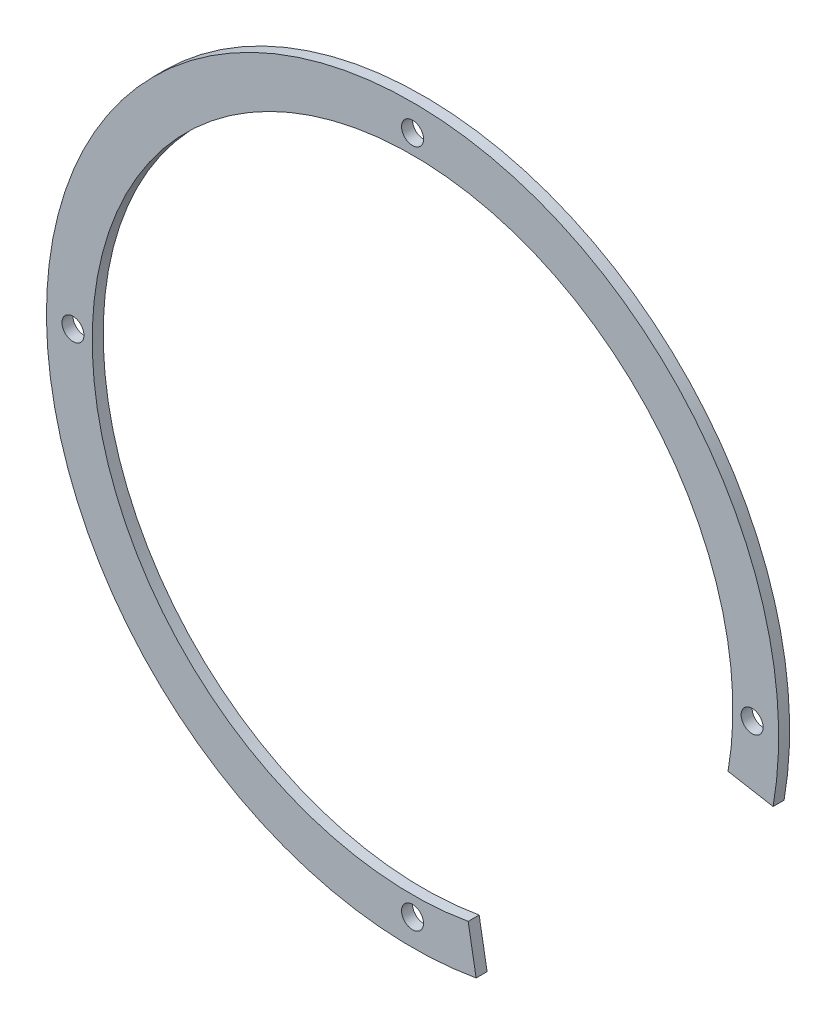
ISO-10303-21;
HEADER;
FILE_DESCRIPTION(('STEP AP214'),'2;1');
FILE_NAME('part.step','',(''),(''),'','','');
FILE_SCHEMA(('AUTOMOTIVE_DESIGN { 1 0 10303 214 1 1 1 1 }'));
ENDSEC;
DATA;
#1=APPLICATION_CONTEXT('core data for automotive mechanical design processes');
#2=APPLICATION_PROTOCOL_DEFINITION('international standard','automotive_design',2000,#1);
#3=PRODUCT_CONTEXT('',#1,'mechanical');
#4=PRODUCT('Part','Part','',(#3));
#5=PRODUCT_RELATED_PRODUCT_CATEGORY('part','',(#4));
#6=PRODUCT_DEFINITION_FORMATION('','',#4);
#7=PRODUCT_DEFINITION_CONTEXT('part definition',#1,'design');
#8=PRODUCT_DEFINITION('design','',#6,#7);
#9=PRODUCT_DEFINITION_SHAPE('','',#8);
#10=(LENGTH_UNIT() NAMED_UNIT(*) SI_UNIT(.MILLI.,.METRE.));
#11=(NAMED_UNIT(*) PLANE_ANGLE_UNIT() SI_UNIT($,.RADIAN.));
#12=(NAMED_UNIT(*) SI_UNIT($,.STERADIAN.) SOLID_ANGLE_UNIT());
#13=UNCERTAINTY_MEASURE_WITH_UNIT(LENGTH_MEASURE(1.E-05),#10,'distance_accuracy_value','');
#14=(GEOMETRIC_REPRESENTATION_CONTEXT(3) GLOBAL_UNCERTAINTY_ASSIGNED_CONTEXT((#13)) GLOBAL_UNIT_ASSIGNED_CONTEXT((#10,
#11,#12)) REPRESENTATION_CONTEXT('',''));
#15=CARTESIAN_POINT('',(0.,0.,0.));
#16=DIRECTION('',(0.,0.,1.));
#17=DIRECTION('',(1.,0.,0.));
#18=AXIS2_PLACEMENT_3D('',#15,#16,#17);
#19=CARTESIAN_POINT('',(0.,0.,3.));
#20=DIRECTION('',(0.,0.,1.));
#21=DIRECTION('',(1.,0.,0.));
#22=AXIS2_PLACEMENT_3D('',#19,#20,#21);
#23=PLANE('',#22);
#24=CARTESIAN_POINT('',(5.2949446201611E-12,-92.75,3.));
#25=DIRECTION('',(0.,0.,1.));
#26=DIRECTION('',(1.,0.,0.));
#27=AXIS2_PLACEMENT_3D('',#24,#25,#26);
#28=CIRCLE('',#27,3.);
#29=CARTESIAN_POINT('',(3.0000000000053,-92.75,3.));
#30=VERTEX_POINT('',#29);
#31=EDGE_CURVE('E109',#30,#30,#28,.T.);
#32=ORIENTED_EDGE('',*,*,#31,.F.);
#33=EDGE_LOOP('',(#32));
#34=FACE_BOUND('',#33,.T.);
#35=CARTESIAN_POINT('',(0.,92.75,3.));
#36=DIRECTION('',(0.,0.,1.));
#37=DIRECTION('',(1.,0.,0.));
#38=AXIS2_PLACEMENT_3D('',#35,#36,#37);
#39=CIRCLE('',#38,3.);
#40=CARTESIAN_POINT('',(3.,92.75,3.));
#41=VERTEX_POINT('',#40);
#42=EDGE_CURVE('E96',#41,#41,#39,.T.);
#43=ORIENTED_EDGE('',*,*,#42,.F.);
#44=EDGE_LOOP('',(#43));
#45=FACE_BOUND('',#44,.T.);
#46=CARTESIAN_POINT('',(92.7500000000026,2.64741107774059E-12,3.));
#47=DIRECTION('',(0.,0.,1.));
#48=DIRECTION('',(1.,0.,0.));
#49=AXIS2_PLACEMENT_3D('',#46,#47,#48);
#50=CIRCLE('',#49,3.00000000000001);
#51=CARTESIAN_POINT('',(95.7500000000027,2.64741107774059E-12,3.));
#52=VERTEX_POINT('',#51);
#53=EDGE_CURVE('E104',#52,#52,#50,.T.);
#54=ORIENTED_EDGE('',*,*,#53,.F.);
#55=EDGE_LOOP('',(#54));
#56=FACE_BOUND('',#55,.T.);
#57=CARTESIAN_POINT('',(-92.7499999999974,-2.65876967680269E-12,3.));
#58=DIRECTION('',(0.,0.,1.));
#59=DIRECTION('',(1.,0.,0.));
#60=AXIS2_PLACEMENT_3D('',#57,#58,#59);
#61=CIRCLE('',#60,3.00000000000001);
#62=CARTESIAN_POINT('',(-89.7499999999974,-2.65876967680269E-12,3.));
#63=VERTEX_POINT('',#62);
#64=EDGE_CURVE('E115',#63,#63,#61,.T.);
#65=ORIENTED_EDGE('',*,*,#64,.F.);
#66=EDGE_LOOP('',(#65));
#67=FACE_BOUND('',#66,.T.);
#68=CARTESIAN_POINT('',(0.,0.,3.));
#69=DIRECTION('',(0.,0.,1.));
#70=DIRECTION('',(1.,0.,0.));
#71=AXIS2_PLACEMENT_3D('',#68,#69,#70);
#72=CIRCLE('',#71,87.5);
#73=CARTESIAN_POINT('',(86.1706783885682,-15.1942155458564,3.));
#74=VERTEX_POINT('',#73);
#75=CARTESIAN_POINT('',(15.1942155458561,-86.1706783885683,3.));
#76=VERTEX_POINT('',#75);
#77=EDGE_CURVE('E95',#74,#76,#72,.T.);
#78=ORIENTED_EDGE('',*,*,#77,.F.);
#79=DIRECTION('',(0.984807753012208,-0.173648177666931,0.));
#80=VECTOR('',#79,1.);
#81=CARTESIAN_POINT('',(0.,0.,3.));
#82=LINE('',#81,#80);
#83=CARTESIAN_POINT('',(98.4807753012208,-17.3648177666931,3.));
#84=VERTEX_POINT('',#83);
#85=EDGE_CURVE('E60',#74,#84,#82,.T.);
#86=ORIENTED_EDGE('',*,*,#85,.T.);
#87=CARTESIAN_POINT('',(0.,0.,3.));
#88=DIRECTION('',(0.,0.,1.));
#89=DIRECTION('',(1.,0.,0.));
#90=AXIS2_PLACEMENT_3D('',#87,#88,#89);
#91=CIRCLE('',#90,100.);
#92=CARTESIAN_POINT('',(17.3648177666927,-98.4807753012209,3.));
#93=VERTEX_POINT('',#92);
#94=EDGE_CURVE('E11',#84,#93,#91,.T.);
#95=ORIENTED_EDGE('',*,*,#94,.T.);
#96=DIRECTION('',(0.173648177666927,-0.984807753012209,0.));
#97=VECTOR('',#96,1.);
#98=CARTESIAN_POINT('',(0.,0.,3.));
#99=LINE('',#98,#97);
#100=EDGE_CURVE('E92',#76,#93,#99,.T.);
#101=ORIENTED_EDGE('',*,*,#100,.F.);
#102=EDGE_LOOP('',(#78,#86,#95,#101));
#103=FACE_BOUND('',#102,.T.);
#104=ADVANCED_FACE('F37',(#34,#45,#56,#67,#103),#23,.T.);
#105=CARTESIAN_POINT('',(0.,0.,0.));
#106=DIRECTION('',(0.,0.,1.));
#107=DIRECTION('',(1.,0.,0.));
#108=AXIS2_PLACEMENT_3D('',#105,#106,#107);
#109=PLANE('',#108);
#110=CARTESIAN_POINT('',(-92.7499999999974,-2.65876967680269E-12,0.));
#111=DIRECTION('',(0.,0.,1.));
#112=DIRECTION('',(1.,0.,0.));
#113=AXIS2_PLACEMENT_3D('',#110,#111,#112);
#114=CIRCLE('',#113,3.00000000000001);
#115=CARTESIAN_POINT('',(-89.7499999999974,-2.65876967680269E-12,0.));
#116=VERTEX_POINT('',#115);
#117=EDGE_CURVE('E118',#116,#116,#114,.T.);
#118=ORIENTED_EDGE('',*,*,#117,.T.);
#119=EDGE_LOOP('',(#118));
#120=FACE_BOUND('',#119,.T.);
#121=CARTESIAN_POINT('',(5.2949446201611E-12,-92.75,0.));
#122=DIRECTION('',(0.,0.,1.));
#123=DIRECTION('',(1.,0.,0.));
#124=AXIS2_PLACEMENT_3D('',#121,#122,#123);
#125=CIRCLE('',#124,3.);
#126=CARTESIAN_POINT('',(3.0000000000053,-92.75,0.));
#127=VERTEX_POINT('',#126);
#128=EDGE_CURVE('E112',#127,#127,#125,.T.);
#129=ORIENTED_EDGE('',*,*,#128,.T.);
#130=EDGE_LOOP('',(#129));
#131=FACE_BOUND('',#130,.T.);
#132=CARTESIAN_POINT('',(92.7500000000026,2.64741107774059E-12,0.));
#133=DIRECTION('',(0.,0.,1.));
#134=DIRECTION('',(1.,0.,0.));
#135=AXIS2_PLACEMENT_3D('',#132,#133,#134);
#136=CIRCLE('',#135,3.00000000000001);
#137=CARTESIAN_POINT('',(95.7500000000027,2.64741107774059E-12,0.));
#138=VERTEX_POINT('',#137);
#139=EDGE_CURVE('E106',#138,#138,#136,.T.);
#140=ORIENTED_EDGE('',*,*,#139,.T.);
#141=EDGE_LOOP('',(#140));
#142=FACE_BOUND('',#141,.T.);
#143=CARTESIAN_POINT('',(0.,92.75,0.));
#144=DIRECTION('',(0.,0.,1.));
#145=DIRECTION('',(1.,0.,0.));
#146=AXIS2_PLACEMENT_3D('',#143,#144,#145);
#147=CIRCLE('',#146,3.);
#148=CARTESIAN_POINT('',(3.,92.75,0.));
#149=VERTEX_POINT('',#148);
#150=EDGE_CURVE('E100',#149,#149,#147,.T.);
#151=ORIENTED_EDGE('',*,*,#150,.T.);
#152=EDGE_LOOP('',(#151));
#153=FACE_BOUND('',#152,.T.);
#154=DIRECTION('',(0.984807753012208,-0.173648177666931,0.));
#155=VECTOR('',#154,1.);
#156=CARTESIAN_POINT('',(0.,0.,0.));
#157=LINE('',#156,#155);
#158=CARTESIAN_POINT('',(86.1706783885682,-15.1942155458564,0.));
#159=VERTEX_POINT('',#158);
#160=CARTESIAN_POINT('',(98.4807753012208,-17.3648177666931,0.));
#161=VERTEX_POINT('',#160);
#162=EDGE_CURVE('E78',#159,#161,#157,.T.);
#163=ORIENTED_EDGE('',*,*,#162,.F.);
#164=CARTESIAN_POINT('',(0.,0.,0.));
#165=DIRECTION('',(0.,0.,1.));
#166=DIRECTION('',(1.,0.,0.));
#167=AXIS2_PLACEMENT_3D('',#164,#165,#166);
#168=CIRCLE('',#167,87.5);
#169=CARTESIAN_POINT('',(15.1942155458561,-86.1706783885682,0.));
#170=VERTEX_POINT('',#169);
#171=EDGE_CURVE('E90',#159,#170,#168,.T.);
#172=ORIENTED_EDGE('',*,*,#171,.T.);
#173=DIRECTION('',(0.173648177666927,-0.984807753012209,0.));
#174=VECTOR('',#173,1.);
#175=CARTESIAN_POINT('',(0.,0.,0.));
#176=LINE('',#175,#174);
#177=CARTESIAN_POINT('',(17.3648177666927,-98.4807753012209,0.));
#178=VERTEX_POINT('',#177);
#179=EDGE_CURVE('E52',#170,#178,#176,.T.);
#180=ORIENTED_EDGE('',*,*,#179,.T.);
#181=CARTESIAN_POINT('',(0.,0.,0.));
#182=DIRECTION('',(0.,0.,1.));
#183=DIRECTION('',(1.,0.,0.));
#184=AXIS2_PLACEMENT_3D('',#181,#182,#183);
#185=CIRCLE('',#184,100.);
#186=EDGE_CURVE('E41',#161,#178,#185,.T.);
#187=ORIENTED_EDGE('',*,*,#186,.F.);
#188=EDGE_LOOP('',(#163,#172,#180,#187));
#189=FACE_BOUND('',#188,.T.);
#190=ADVANCED_FACE('F89',(#120,#131,#142,#153,#189),#109,.F.);
#191=CARTESIAN_POINT('',(0.,0.,3.));
#192=DIRECTION('',(0.,0.,-1.));
#193=DIRECTION('',(-1.,0.,0.));
#194=AXIS2_PLACEMENT_3D('',#191,#192,#193);
#195=CYLINDRICAL_SURFACE('',#194,100.);
#196=DIRECTION('',(0.,0.,1.));
#197=VECTOR('',#196,1.);
#198=CARTESIAN_POINT('',(98.4807753012208,-17.3648177666931,0.));
#199=LINE('',#198,#197);
#200=EDGE_CURVE('E121',#161,#84,#199,.T.);
#201=ORIENTED_EDGE('',*,*,#200,.F.);
#202=ORIENTED_EDGE('',*,*,#186,.T.);
#203=DIRECTION('',(0.,0.,1.));
#204=VECTOR('',#203,1.);
#205=CARTESIAN_POINT('',(17.3648177666927,-98.4807753012209,0.));
#206=LINE('',#205,#204);
#207=EDGE_CURVE('E125',#178,#93,#206,.T.);
#208=ORIENTED_EDGE('',*,*,#207,.T.);
#209=ORIENTED_EDGE('',*,*,#94,.F.);
#210=EDGE_LOOP('',(#201,#202,#208,#209));
#211=FACE_BOUND('',#210,.T.);
#212=ADVANCED_FACE('F39',(#211),#195,.T.);
#213=CARTESIAN_POINT('',(0.,0.,3.));
#214=DIRECTION('',(0.,0.,-1.));
#215=DIRECTION('',(-1.,0.,0.));
#216=AXIS2_PLACEMENT_3D('',#213,#214,#215);
#217=CYLINDRICAL_SURFACE('',#216,87.5);
#218=ORIENTED_EDGE('',*,*,#171,.F.);
#219=DIRECTION('',(0.,0.,1.));
#220=VECTOR('',#219,1.);
#221=CARTESIAN_POINT('',(86.1706783885682,-15.1942155458564,0.));
#222=LINE('',#221,#220);
#223=EDGE_CURVE('E75',#159,#74,#222,.T.);
#224=ORIENTED_EDGE('',*,*,#223,.T.);
#225=ORIENTED_EDGE('',*,*,#77,.T.);
#226=DIRECTION('',(0.,0.,1.));
#227=VECTOR('',#226,1.);
#228=CARTESIAN_POINT('',(15.1942155458561,-86.1706783885683,0.));
#229=LINE('',#228,#227);
#230=EDGE_CURVE('E84',#170,#76,#229,.T.);
#231=ORIENTED_EDGE('',*,*,#230,.F.);
#232=EDGE_LOOP('',(#218,#224,#225,#231));
#233=FACE_BOUND('',#232,.T.);
#234=ADVANCED_FACE('F94',(#233),#217,.F.);
#235=CARTESIAN_POINT('',(0.,92.75,3.));
#236=DIRECTION('',(0.,0.,-1.));
#237=DIRECTION('',(-1.,0.,0.));
#238=AXIS2_PLACEMENT_3D('',#235,#236,#237);
#239=CYLINDRICAL_SURFACE('',#238,3.);
#240=ORIENTED_EDGE('',*,*,#42,.T.);
#241=EDGE_LOOP('',(#240));
#242=FACE_BOUND('',#241,.T.);
#243=ORIENTED_EDGE('',*,*,#150,.F.);
#244=EDGE_LOOP('',(#243));
#245=FACE_BOUND('',#244,.T.);
#246=ADVANCED_FACE('F161',(#242,#245),#239,.F.);
#247=CARTESIAN_POINT('',(92.7500000000026,2.64741107774059E-12,3.));
#248=DIRECTION('',(0.,0.,-1.));
#249=DIRECTION('',(-1.,0.,0.));
#250=AXIS2_PLACEMENT_3D('',#247,#248,#249);
#251=CYLINDRICAL_SURFACE('',#250,3.00000000000001);
#252=ORIENTED_EDGE('',*,*,#53,.T.);
#253=EDGE_LOOP('',(#252));
#254=FACE_BOUND('',#253,.T.);
#255=ORIENTED_EDGE('',*,*,#139,.F.);
#256=EDGE_LOOP('',(#255));
#257=FACE_BOUND('',#256,.T.);
#258=ADVANCED_FACE('F164',(#254,#257),#251,.F.);
#259=CARTESIAN_POINT('',(5.2949446201611E-12,-92.75,3.));
#260=DIRECTION('',(0.,0.,-1.));
#261=DIRECTION('',(-1.,0.,0.));
#262=AXIS2_PLACEMENT_3D('',#259,#260,#261);
#263=CYLINDRICAL_SURFACE('',#262,3.);
#264=ORIENTED_EDGE('',*,*,#31,.T.);
#265=EDGE_LOOP('',(#264));
#266=FACE_BOUND('',#265,.T.);
#267=ORIENTED_EDGE('',*,*,#128,.F.);
#268=EDGE_LOOP('',(#267));
#269=FACE_BOUND('',#268,.T.);
#270=ADVANCED_FACE('F145',(#266,#269),#263,.F.);
#271=CARTESIAN_POINT('',(-92.7499999999974,-2.65876967680269E-12,3.));
#272=DIRECTION('',(0.,0.,-1.));
#273=DIRECTION('',(-1.,0.,0.));
#274=AXIS2_PLACEMENT_3D('',#271,#272,#273);
#275=CYLINDRICAL_SURFACE('',#274,3.00000000000001);
#276=ORIENTED_EDGE('',*,*,#64,.T.);
#277=EDGE_LOOP('',(#276));
#278=FACE_BOUND('',#277,.T.);
#279=ORIENTED_EDGE('',*,*,#117,.F.);
#280=EDGE_LOOP('',(#279));
#281=FACE_BOUND('',#280,.T.);
#282=ADVANCED_FACE('F137',(#278,#281),#275,.F.);
#283=CARTESIAN_POINT('',(0.,0.,0.));
#284=DIRECTION('',(-0.984807753012208,-0.173648177666927,0.));
#285=DIRECTION('',(0.173648177666927,-0.984807753012209,0.));
#286=AXIS2_PLACEMENT_3D('',#283,#284,#285);
#287=PLANE('',#286);
#288=ORIENTED_EDGE('',*,*,#100,.T.);
#289=ORIENTED_EDGE('',*,*,#207,.F.);
#290=ORIENTED_EDGE('',*,*,#179,.F.);
#291=ORIENTED_EDGE('',*,*,#230,.T.);
#292=EDGE_LOOP('',(#288,#289,#290,#291));
#293=FACE_BOUND('',#292,.T.);
#294=ADVANCED_FACE('F135',(#293),#287,.F.);
#295=CARTESIAN_POINT('',(0.,0.,0.));
#296=DIRECTION('',(-0.173648177666931,-0.984807753012208,0.));
#297=DIRECTION('',(0.984807753012208,-0.173648177666931,0.));
#298=AXIS2_PLACEMENT_3D('',#295,#296,#297);
#299=PLANE('',#298);
#300=ORIENTED_EDGE('',*,*,#85,.F.);
#301=ORIENTED_EDGE('',*,*,#223,.F.);
#302=ORIENTED_EDGE('',*,*,#162,.T.);
#303=ORIENTED_EDGE('',*,*,#200,.T.);
#304=EDGE_LOOP('',(#300,#301,#302,#303));
#305=FACE_BOUND('',#304,.T.);
#306=ADVANCED_FACE('F77',(#305),#299,.T.);
#307=CLOSED_SHELL('',(#104,#190,#212,#234,#246,#258,#270,#282,#294,#306));
#308=MANIFOLD_SOLID_BREP('B2',#307);
#309=ADVANCED_BREP_SHAPE_REPRESENTATION('',(#18,#308),#14);
#310=SHAPE_DEFINITION_REPRESENTATION(#9,#309);
ENDSEC;
END-ISO-10303-21;
